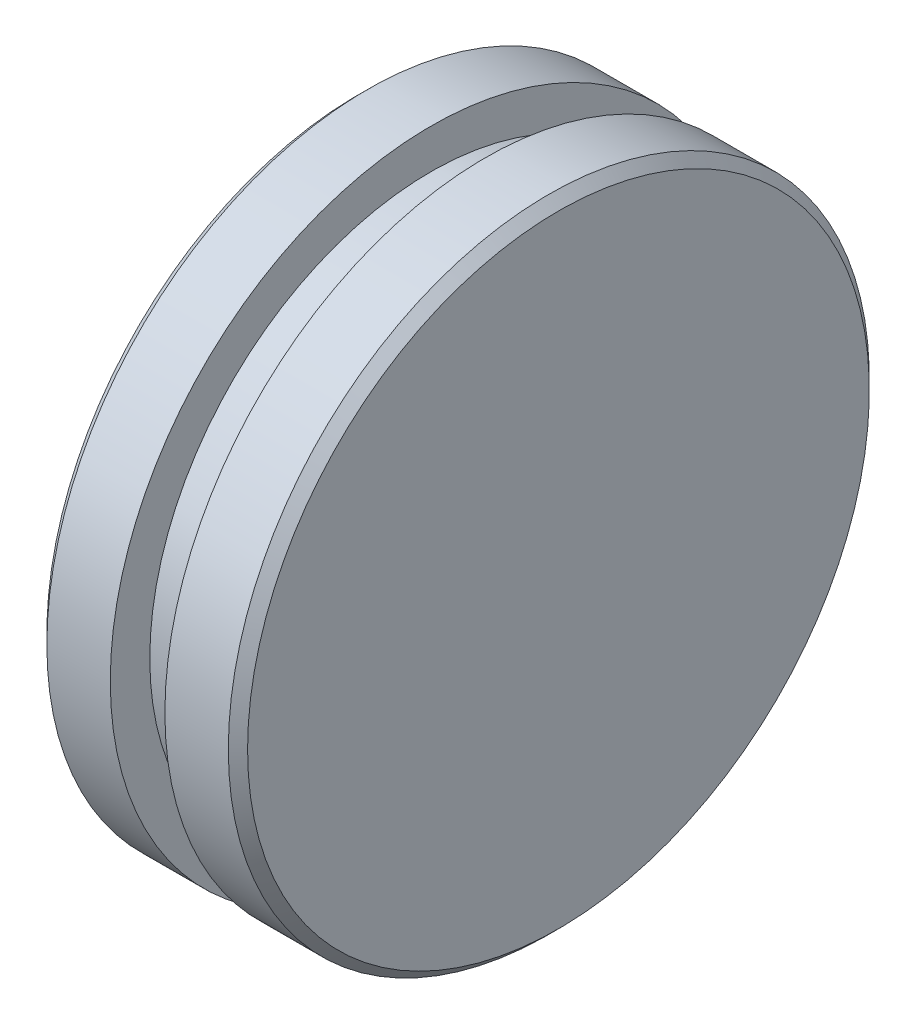
ISO-10303-21;
HEADER;
FILE_DESCRIPTION(('STEP AP214'),'2;1');
FILE_NAME('part.step','',(''),(''),'','','');
FILE_SCHEMA(('AUTOMOTIVE_DESIGN { 1 0 10303 214 1 1 1 1 }'));
ENDSEC;
DATA;
#1=APPLICATION_CONTEXT('core data for automotive mechanical design processes');
#2=APPLICATION_PROTOCOL_DEFINITION('international standard','automotive_design',2000,#1);
#3=PRODUCT_CONTEXT('',#1,'mechanical');
#4=PRODUCT('Part','Part','',(#3));
#5=PRODUCT_RELATED_PRODUCT_CATEGORY('part','',(#4));
#6=PRODUCT_DEFINITION_FORMATION('','',#4);
#7=PRODUCT_DEFINITION_CONTEXT('part definition',#1,'design');
#8=PRODUCT_DEFINITION('design','',#6,#7);
#9=PRODUCT_DEFINITION_SHAPE('','',#8);
#10=(LENGTH_UNIT() NAMED_UNIT(*) SI_UNIT(.MILLI.,.METRE.));
#11=(NAMED_UNIT(*) PLANE_ANGLE_UNIT() SI_UNIT($,.RADIAN.));
#12=(NAMED_UNIT(*) SI_UNIT($,.STERADIAN.) SOLID_ANGLE_UNIT());
#13=UNCERTAINTY_MEASURE_WITH_UNIT(LENGTH_MEASURE(1.E-05),#10,'distance_accuracy_value','');
#14=(GEOMETRIC_REPRESENTATION_CONTEXT(3) GLOBAL_UNCERTAINTY_ASSIGNED_CONTEXT((#13)) GLOBAL_UNIT_ASSIGNED_CONTEXT((#10,
#11,#12)) REPRESENTATION_CONTEXT('',''));
#15=CARTESIAN_POINT('',(0.,0.,0.));
#16=DIRECTION('',(0.,0.,1.));
#17=DIRECTION('',(1.,0.,0.));
#18=AXIS2_PLACEMENT_3D('',#15,#16,#17);
#19=CARTESIAN_POINT('',(0.,0.998,0.));
#20=DIRECTION('',(1.,0.,0.));
#21=DIRECTION('',(0.,0.,-1.));
#22=AXIS2_PLACEMENT_3D('',#19,#20,#21);
#23=PLANE('',#22);
#24=CARTESIAN_POINT('',(0.,0.,0.));
#25=DIRECTION('',(1.,0.,0.));
#26=DIRECTION('',(0.,0.,-1.));
#27=AXIS2_PLACEMENT_3D('',#24,#25,#26);
#28=CIRCLE('',#27,0.968);
#29=CARTESIAN_POINT('',(0.,0.,-0.968));
#30=VERTEX_POINT('',#29);
#31=EDGE_CURVE('E38',#30,#30,#28,.F.);
#32=ORIENTED_EDGE('',*,*,#31,.T.);
#33=EDGE_LOOP('',(#32));
#34=FACE_BOUND('',#33,.T.);
#35=CARTESIAN_POINT('',(0.,0.,0.));
#36=DIRECTION('',(-1.,0.,0.));
#37=DIRECTION('',(0.,0.,1.));
#38=AXIS2_PLACEMENT_3D('',#35,#36,#37);
#39=CIRCLE('',#38,0.1875);
#40=CARTESIAN_POINT('',(0.,0.,0.1875));
#41=VERTEX_POINT('',#40);
#42=EDGE_CURVE('E51',#41,#41,#39,.T.);
#43=ORIENTED_EDGE('',*,*,#42,.F.);
#44=EDGE_LOOP('',(#43));
#45=FACE_BOUND('',#44,.T.);
#46=ADVANCED_FACE('F31',(#34,#45),#23,.F.);
#47=CARTESIAN_POINT('',(0.,0.,0.));
#48=DIRECTION('',(-1.,0.,0.));
#49=DIRECTION('',(0.,0.,1.));
#50=AXIS2_PLACEMENT_3D('',#47,#48,#49);
#51=CYLINDRICAL_SURFACE('',#50,0.1875);
#52=CARTESIAN_POINT('',(0.55,0.,0.));
#53=DIRECTION('',(-1.,0.,0.));
#54=DIRECTION('',(0.,0.,1.));
#55=AXIS2_PLACEMENT_3D('',#52,#53,#54);
#56=CIRCLE('',#55,0.1875);
#57=CARTESIAN_POINT('',(0.55,0.,0.1875));
#58=VERTEX_POINT('',#57);
#59=EDGE_CURVE('E54',#58,#58,#56,.T.);
#60=ORIENTED_EDGE('',*,*,#59,.F.);
#61=EDGE_LOOP('',(#60));
#62=FACE_BOUND('',#61,.T.);
#63=ORIENTED_EDGE('',*,*,#42,.T.);
#64=EDGE_LOOP('',(#63));
#65=FACE_BOUND('',#64,.T.);
#66=ADVANCED_FACE('F102',(#62,#65),#51,.F.);
#67=CARTESIAN_POINT('',(0.55,0.1,0.));
#68=DIRECTION('',(1.,0.,0.));
#69=DIRECTION('',(0.,0.,-1.));
#70=AXIS2_PLACEMENT_3D('',#67,#68,#69);
#71=PLANE('',#70);
#72=ORIENTED_EDGE('',*,*,#59,.T.);
#73=EDGE_LOOP('',(#72));
#74=FACE_BOUND('',#73,.T.);
#75=ADVANCED_FACE('F98',(#74),#71,.F.);
#76=CARTESIAN_POINT('',(0.625,0.,0.));
#77=DIRECTION('',(-1.,0.,0.));
#78=DIRECTION('',(0.,0.,1.));
#79=AXIS2_PLACEMENT_3D('',#76,#77,#78);
#80=PLANE('',#79);
#81=CARTESIAN_POINT('',(0.625,0.,0.));
#82=DIRECTION('',(-1.,0.,0.));
#83=DIRECTION('',(0.,0.,1.));
#84=AXIS2_PLACEMENT_3D('',#81,#82,#83);
#85=CIRCLE('',#84,0.968);
#86=CARTESIAN_POINT('',(0.625,0.,0.968));
#87=VERTEX_POINT('',#86);
#88=EDGE_CURVE('E42',#87,#87,#85,.F.);
#89=ORIENTED_EDGE('',*,*,#88,.T.);
#90=EDGE_LOOP('',(#89));
#91=FACE_BOUND('',#90,.T.);
#92=ADVANCED_FACE('F92',(#91),#80,.F.);
#93=CARTESIAN_POINT('',(0.,0.,0.));
#94=DIRECTION('',(-1.,0.,0.));
#95=DIRECTION('',(0.,0.,1.));
#96=AXIS2_PLACEMENT_3D('',#93,#94,#95);
#97=CYLINDRICAL_SURFACE('',#96,0.998);
#98=CARTESIAN_POINT('',(0.595,0.,0.));
#99=DIRECTION('',(-1.,0.,0.));
#100=DIRECTION('',(0.,0.,1.));
#101=AXIS2_PLACEMENT_3D('',#98,#99,#100);
#102=CIRCLE('',#101,0.998);
#103=CARTESIAN_POINT('',(0.595,0.,0.998));
#104=VERTEX_POINT('',#103);
#105=EDGE_CURVE('E46',#104,#104,#102,.T.);
#106=ORIENTED_EDGE('',*,*,#105,.T.);
#107=EDGE_LOOP('',(#106));
#108=FACE_BOUND('',#107,.T.);
#109=CARTESIAN_POINT('',(0.3975,0.,0.));
#110=DIRECTION('',(-1.,0.,0.));
#111=DIRECTION('',(0.,0.,1.));
#112=AXIS2_PLACEMENT_3D('',#109,#110,#111);
#113=CIRCLE('',#112,0.998);
#114=CARTESIAN_POINT('',(0.3975,0.,0.998));
#115=VERTEX_POINT('',#114);
#116=EDGE_CURVE('E57',#115,#115,#113,.T.);
#117=ORIENTED_EDGE('',*,*,#116,.F.);
#118=EDGE_LOOP('',(#117));
#119=FACE_BOUND('',#118,.T.);
#120=ADVANCED_FACE('F87',(#108,#119),#97,.T.);
#121=CARTESIAN_POINT('',(0.3975,0.998,0.));
#122=DIRECTION('',(1.,0.,0.));
#123=DIRECTION('',(0.,0.,-1.));
#124=AXIS2_PLACEMENT_3D('',#121,#122,#123);
#125=PLANE('',#124);
#126=CARTESIAN_POINT('',(0.3975,0.,0.));
#127=DIRECTION('',(-1.,0.,0.));
#128=DIRECTION('',(0.,0.,1.));
#129=AXIS2_PLACEMENT_3D('',#126,#127,#128);
#130=CIRCLE('',#129,0.875);
#131=CARTESIAN_POINT('',(0.3975,0.,0.875));
#132=VERTEX_POINT('',#131);
#133=EDGE_CURVE('E60',#132,#132,#130,.T.);
#134=ORIENTED_EDGE('',*,*,#133,.F.);
#135=EDGE_LOOP('',(#134));
#136=FACE_BOUND('',#135,.T.);
#137=ORIENTED_EDGE('',*,*,#116,.T.);
#138=EDGE_LOOP('',(#137));
#139=FACE_BOUND('',#138,.T.);
#140=ADVANCED_FACE('F81',(#136,#139),#125,.F.);
#141=CARTESIAN_POINT('',(0.,0.,0.));
#142=DIRECTION('',(-1.,0.,0.));
#143=DIRECTION('',(0.,0.,1.));
#144=AXIS2_PLACEMENT_3D('',#141,#142,#143);
#145=CYLINDRICAL_SURFACE('',#144,0.875);
#146=CARTESIAN_POINT('',(0.2275,0.,0.));
#147=DIRECTION('',(-1.,0.,0.));
#148=DIRECTION('',(0.,0.,1.));
#149=AXIS2_PLACEMENT_3D('',#146,#147,#148);
#150=CIRCLE('',#149,0.875);
#151=CARTESIAN_POINT('',(0.2275,0.,0.875));
#152=VERTEX_POINT('',#151);
#153=EDGE_CURVE('E63',#152,#152,#150,.T.);
#154=ORIENTED_EDGE('',*,*,#153,.F.);
#155=EDGE_LOOP('',(#154));
#156=FACE_BOUND('',#155,.T.);
#157=ORIENTED_EDGE('',*,*,#133,.T.);
#158=EDGE_LOOP('',(#157));
#159=FACE_BOUND('',#158,.T.);
#160=ADVANCED_FACE('F75',(#156,#159),#145,.T.);
#161=CARTESIAN_POINT('',(0.2275,0.875,0.));
#162=DIRECTION('',(-1.,0.,0.));
#163=DIRECTION('',(0.,0.,1.));
#164=AXIS2_PLACEMENT_3D('',#161,#162,#163);
#165=PLANE('',#164);
#166=CARTESIAN_POINT('',(0.2275,0.,0.));
#167=DIRECTION('',(-1.,0.,0.));
#168=DIRECTION('',(0.,0.,1.));
#169=AXIS2_PLACEMENT_3D('',#166,#167,#168);
#170=CIRCLE('',#169,0.998);
#171=CARTESIAN_POINT('',(0.2275,0.,0.998));
#172=VERTEX_POINT('',#171);
#173=EDGE_CURVE('E66',#172,#172,#170,.T.);
#174=ORIENTED_EDGE('',*,*,#173,.F.);
#175=EDGE_LOOP('',(#174));
#176=FACE_BOUND('',#175,.T.);
#177=ORIENTED_EDGE('',*,*,#153,.T.);
#178=EDGE_LOOP('',(#177));
#179=FACE_BOUND('',#178,.T.);
#180=ADVANCED_FACE('F72',(#176,#179),#165,.F.);
#181=CARTESIAN_POINT('',(0.,0.,0.));
#182=DIRECTION('',(-1.,0.,0.));
#183=DIRECTION('',(0.,0.,1.));
#184=AXIS2_PLACEMENT_3D('',#181,#182,#183);
#185=CYLINDRICAL_SURFACE('',#184,0.998);
#186=CARTESIAN_POINT('',(0.0299999999999999,0.,0.));
#187=DIRECTION('',(1.,0.,0.));
#188=DIRECTION('',(0.,0.,-1.));
#189=AXIS2_PLACEMENT_3D('',#186,#187,#188);
#190=CIRCLE('',#189,0.998);
#191=CARTESIAN_POINT('',(0.0299999999999999,0.,-0.998));
#192=VERTEX_POINT('',#191);
#193=EDGE_CURVE('E10',#192,#192,#190,.T.);
#194=ORIENTED_EDGE('',*,*,#193,.T.);
#195=EDGE_LOOP('',(#194));
#196=FACE_BOUND('',#195,.T.);
#197=ORIENTED_EDGE('',*,*,#173,.T.);
#198=EDGE_LOOP('',(#197));
#199=FACE_BOUND('',#198,.T.);
#200=ADVANCED_FACE('F70',(#196,#199),#185,.T.);
#201=CARTESIAN_POINT('',(0.595,0.,0.));
#202=DIRECTION('',(-1.,0.,0.));
#203=DIRECTION('',(0.,0.,1.));
#204=AXIS2_PLACEMENT_3D('',#201,#202,#203);
#205=CONICAL_SURFACE('',#204,0.998,0.785398163397448);
#206=ORIENTED_EDGE('',*,*,#88,.F.);
#207=EDGE_LOOP('',(#206));
#208=FACE_BOUND('',#207,.T.);
#209=ORIENTED_EDGE('',*,*,#105,.F.);
#210=EDGE_LOOP('',(#209));
#211=FACE_BOUND('',#210,.T.);
#212=ADVANCED_FACE('F111',(#208,#211),#205,.T.);
#213=CARTESIAN_POINT('',(0.,0.,0.));
#214=DIRECTION('',(1.,0.,0.));
#215=DIRECTION('',(0.,0.,-1.));
#216=AXIS2_PLACEMENT_3D('',#213,#214,#215);
#217=CONICAL_SURFACE('',#216,0.968,0.785398163397455);
#218=ORIENTED_EDGE('',*,*,#193,.F.);
#219=EDGE_LOOP('',(#218));
#220=FACE_BOUND('',#219,.T.);
#221=ORIENTED_EDGE('',*,*,#31,.F.);
#222=EDGE_LOOP('',(#221));
#223=FACE_BOUND('',#222,.T.);
#224=ADVANCED_FACE('F33',(#220,#223),#217,.T.);
#225=CLOSED_SHELL('',(#46,#66,#75,#92,#120,#140,#160,#180,#200,#212,#224));
#226=MANIFOLD_SOLID_BREP('B2',#225);
#227=ADVANCED_BREP_SHAPE_REPRESENTATION('',(#18,#226),#14);
#228=SHAPE_DEFINITION_REPRESENTATION(#9,#227);
ENDSEC;
END-ISO-10303-21;
